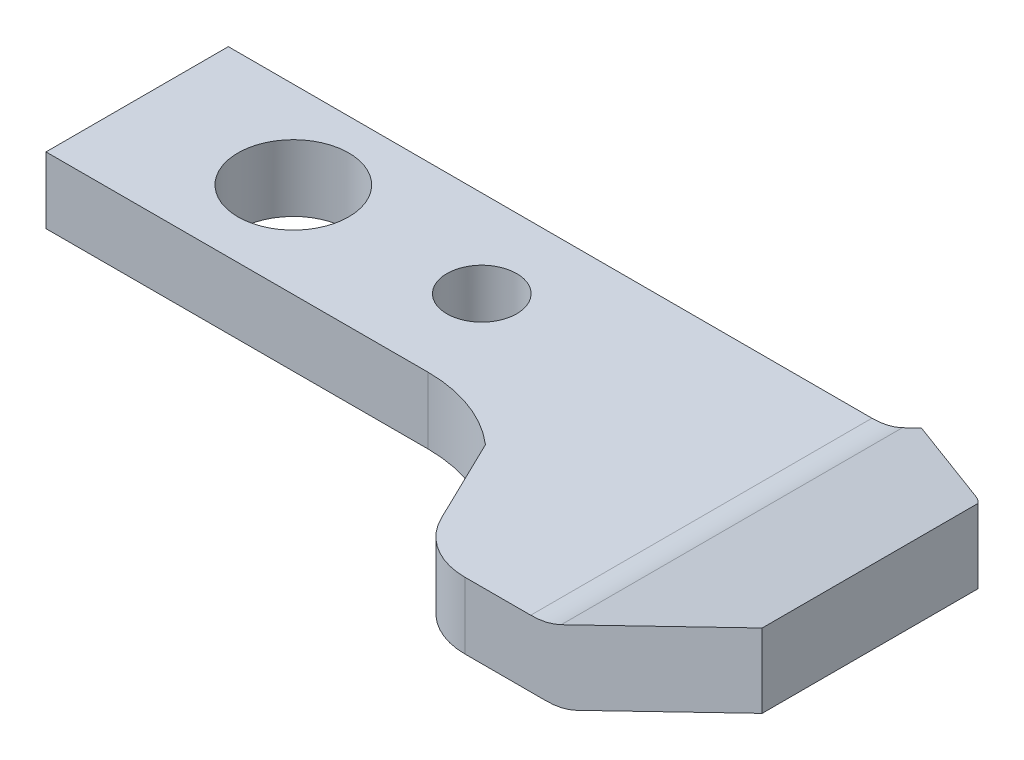
ISO-10303-21;
HEADER;
FILE_DESCRIPTION(('STEP AP214'),'2;1');
FILE_NAME('part.step','',(''),(''),'','','');
FILE_SCHEMA(('AUTOMOTIVE_DESIGN { 1 0 10303 214 1 1 1 1 }'));
ENDSEC;
DATA;
#1=APPLICATION_CONTEXT('core data for automotive mechanical design processes');
#2=APPLICATION_PROTOCOL_DEFINITION('international standard','automotive_design',2000,#1);
#3=PRODUCT_CONTEXT('',#1,'mechanical');
#4=PRODUCT('Part','Part','',(#3));
#5=PRODUCT_RELATED_PRODUCT_CATEGORY('part','',(#4));
#6=PRODUCT_DEFINITION_FORMATION('','',#4);
#7=PRODUCT_DEFINITION_CONTEXT('part definition',#1,'design');
#8=PRODUCT_DEFINITION('design','',#6,#7);
#9=PRODUCT_DEFINITION_SHAPE('','',#8);
#10=(LENGTH_UNIT() NAMED_UNIT(*) SI_UNIT(.MILLI.,.METRE.));
#11=(NAMED_UNIT(*) PLANE_ANGLE_UNIT() SI_UNIT($,.RADIAN.));
#12=(NAMED_UNIT(*) SI_UNIT($,.STERADIAN.) SOLID_ANGLE_UNIT());
#13=UNCERTAINTY_MEASURE_WITH_UNIT(LENGTH_MEASURE(1.E-05),#10,'distance_accuracy_value','');
#14=(GEOMETRIC_REPRESENTATION_CONTEXT(3) GLOBAL_UNCERTAINTY_ASSIGNED_CONTEXT((#13)) GLOBAL_UNIT_ASSIGNED_CONTEXT((#10,
#11,#12)) REPRESENTATION_CONTEXT('',''));
#15=CARTESIAN_POINT('',(0.,0.,0.));
#16=DIRECTION('',(0.,0.,1.));
#17=DIRECTION('',(1.,0.,0.));
#18=AXIS2_PLACEMENT_3D('',#15,#16,#17);
#19=CARTESIAN_POINT('',(-11.156946072554,-141.033274081149,100.));
#20=DIRECTION('',(0.436957173482005,-0.899482311411746,0.));
#21=DIRECTION('',(-0.899482311411746,-0.436957173482005,0.));
#22=AXIS2_PLACEMENT_3D('',#19,#20,#21);
#23=PLANE('',#22);
#24=DIRECTION('',(0.899482311411746,0.436957173482005,0.));
#25=VECTOR('',#24,1.);
#26=CARTESIAN_POINT('',(-11.156946072554,-141.033274081149,48.8915210531004));
#27=LINE('',#26,#25);
#28=CARTESIAN_POINT('',(-93.4183407198461,-180.994823114117,48.8915210531005));
#29=VERTEX_POINT('',#28);
#30=CARTESIAN_POINT('',(-64.6259510493756,-167.007842993902,48.8915210531005));
#31=VERTEX_POINT('',#30);
#32=EDGE_CURVE('E143',#29,#31,#27,.T.);
#33=ORIENTED_EDGE('',*,*,#32,.T.);
#34=DIRECTION('',(0.,0.,1.));
#35=VECTOR('',#34,1.);
#36=CARTESIAN_POINT('',(-64.6259510493756,-167.007842993902,100.));
#37=LINE('',#36,#35);
#38=CARTESIAN_POINT('',(-64.6259510493756,-167.007842993902,17.9722794085449));
#39=VERTEX_POINT('',#38);
#40=EDGE_CURVE('E146',#39,#31,#37,.T.);
#41=ORIENTED_EDGE('',*,*,#40,.F.);
#42=CARTESIAN_POINT('',(-72.0254817983418,-170.602441798282,24.6988643292236));
#43=DIRECTION('',(-0.436957173482005,0.899482311411746,0.));
#44=DIRECTION('',(0.899482311411746,0.436957173482005,0.));
#45=AXIS2_PLACEMENT_3D('',#42,#43,#44);
#46=ELLIPSE('',#45,11.117506006655,9.99999999999999);
#47=CARTESIAN_POINT('',(-66.4231735756112,-167.880911052294,16.4154989154848));
#48=VERTEX_POINT('',#47);
#49=EDGE_CURVE('E237',#48,#39,#46,.F.);
#50=ORIENTED_EDGE('',*,*,#49,.F.);
#51=DIRECTION('',(0.768454775547927,0.373305647495344,0.519730845232094));
#52=VECTOR('',#51,1.);
#53=CARTESIAN_POINT('',(7.29731681736619,-132.068425691393,66.2750534423562));
#54=LINE('',#53,#52);
#55=CARTESIAN_POINT('',(-90.6063758633585,-179.628806017358,0.0596162202828217));
#56=VERTEX_POINT('',#55);
#57=EDGE_CURVE('E239',#56,#48,#54,.T.);
#58=ORIENTED_EDGE('',*,*,#57,.F.);
#59=CARTESIAN_POINT('',(-96.2086840860891,-182.350336763346,8.34298163402165));
#60=DIRECTION('',(-0.436957173482005,0.899482311411746,0.));
#61=DIRECTION('',(0.899482311411746,0.436957173482005,0.));
#62=AXIS2_PLACEMENT_3D('',#59,#60,#61);
#63=ELLIPSE('',#62,11.117506006655,9.99999999999999);
#64=CARTESIAN_POINT('',(-90.6955490927865,-179.672125248639,0.));
#65=VERTEX_POINT('',#64);
#66=EDGE_CURVE('E216',#56,#65,#63,.T.);
#67=ORIENTED_EDGE('',*,*,#66,.T.);
#68=DIRECTION('',(0.899482311411746,0.436957173482005,0.));
#69=VECTOR('',#68,1.);
#70=CARTESIAN_POINT('',(-11.156946072554,-141.033274081149,0.));
#71=LINE('',#70,#69);
#72=CARTESIAN_POINT('',(-93.418340719846,-180.994823114117,0.));
#73=VERTEX_POINT('',#72);
#74=EDGE_CURVE('E245',#73,#65,#71,.T.);
#75=ORIENTED_EDGE('',*,*,#74,.F.);
#76=DIRECTION('',(0.,0.,-1.));
#77=VECTOR('',#76,1.);
#78=CARTESIAN_POINT('',(-93.418340719846,-180.994823114117,0.));
#79=LINE('',#78,#77);
#80=EDGE_CURVE('E150',#29,#73,#79,.T.);
#81=ORIENTED_EDGE('',*,*,#80,.F.);
#82=EDGE_LOOP('',(#33,#41,#50,#58,#67,#75,#81));
#83=FACE_BOUND('',#82,.T.);
#84=ADVANCED_FACE('F36',(#83),#23,.F.);
#85=CARTESIAN_POINT('',(-6.9927442092705,-149.605340508903,100.));
#86=DIRECTION('',(0.436957173482005,-0.899482311411746,0.));
#87=DIRECTION('',(-0.899482311411746,-0.436957173482005,0.));
#88=AXIS2_PLACEMENT_3D('',#85,#86,#87);
#89=PLANE('',#88);
#90=DIRECTION('',(0.,0.,1.));
#91=VECTOR('',#90,1.);
#92=CARTESIAN_POINT('',(-64.6259510493756,-177.602826218245,100.));
#93=LINE('',#92,#91);
#94=CARTESIAN_POINT('',(-64.6259510493756,-177.602826218245,17.9722794085449));
#95=VERTEX_POINT('',#94);
#96=CARTESIAN_POINT('',(-64.6259510493756,-177.602826218245,48.8915210531005));
#97=VERTEX_POINT('',#96);
#98=EDGE_CURVE('E163',#95,#97,#93,.T.);
#99=ORIENTED_EDGE('',*,*,#98,.T.);
#100=DIRECTION('',(0.899482311411746,0.436957173482005,0.));
#101=VECTOR('',#100,1.);
#102=CARTESIAN_POINT('',(-6.99274420927052,-149.605340508903,48.8915210531004));
#103=LINE('',#102,#101);
#104=CARTESIAN_POINT('',(-91.2260582025171,-190.524823114117,48.8915210531005));
#105=VERTEX_POINT('',#104);
#106=EDGE_CURVE('E153',#105,#97,#103,.T.);
#107=ORIENTED_EDGE('',*,*,#106,.F.);
#108=DIRECTION('',(0.,0.,-1.));
#109=VECTOR('',#108,1.);
#110=CARTESIAN_POINT('',(-91.2260582025171,-190.524823114117,100.));
#111=LINE('',#110,#109);
#112=CARTESIAN_POINT('',(-91.2260582025171,-190.524823114117,0.));
#113=VERTEX_POINT('',#112);
#114=EDGE_CURVE('E271',#113,#105,#111,.F.);
#115=ORIENTED_EDGE('',*,*,#114,.F.);
#116=DIRECTION('',(0.899482311411746,0.436957173482005,0.));
#117=VECTOR('',#116,1.);
#118=CARTESIAN_POINT('',(-6.9927442092705,-149.605340508903,0.));
#119=LINE('',#118,#117);
#120=CARTESIAN_POINT('',(-90.6955490927865,-190.267108472981,0.));
#121=VERTEX_POINT('',#120);
#122=EDGE_CURVE('E248',#113,#121,#119,.T.);
#123=ORIENTED_EDGE('',*,*,#122,.T.);
#124=CARTESIAN_POINT('',(-96.2086840860891,-192.945319987688,8.34298163402165));
#125=DIRECTION('',(-0.436957173482005,0.899482311411746,0.));
#126=DIRECTION('',(0.899482311411746,0.436957173482005,0.));
#127=AXIS2_PLACEMENT_3D('',#124,#125,#126);
#128=ELLIPSE('',#127,11.117506006655,9.99999999999999);
#129=CARTESIAN_POINT('',(-90.6063758633585,-190.2237892417,0.0596162202828356));
#130=VERTEX_POINT('',#129);
#131=EDGE_CURVE('E201',#130,#121,#128,.T.);
#132=ORIENTED_EDGE('',*,*,#131,.F.);
#133=DIRECTION('',(0.768454775547927,0.373305647495344,0.519730845232094));
#134=VECTOR('',#133,1.);
#135=CARTESIAN_POINT('',(10.3366838425226,-141.186922710684,68.3306757681187));
#136=LINE('',#135,#134);
#137=CARTESIAN_POINT('',(-66.4231735756112,-178.475894276636,16.4154989154848));
#138=VERTEX_POINT('',#137);
#139=EDGE_CURVE('E261',#130,#138,#136,.T.);
#140=ORIENTED_EDGE('',*,*,#139,.T.);
#141=CARTESIAN_POINT('',(-72.0254817983418,-181.197425022624,24.6988643292236));
#142=DIRECTION('',(-0.436957173482005,0.899482311411746,0.));
#143=DIRECTION('',(0.899482311411746,0.436957173482005,0.));
#144=AXIS2_PLACEMENT_3D('',#141,#142,#143);
#145=ELLIPSE('',#144,11.117506006655,9.99999999999999);
#146=EDGE_CURVE('E258',#138,#95,#145,.F.);
#147=ORIENTED_EDGE('',*,*,#146,.T.);
#148=EDGE_LOOP('',(#99,#107,#115,#123,#132,#140,#147));
#149=FACE_BOUND('',#148,.T.);
#150=ADVANCED_FACE('F308',(#149),#89,.T.);
#151=CARTESIAN_POINT('',(0.,-182.,100.));
#152=DIRECTION('',(0.,-1.,0.));
#153=DIRECTION('',(-1.,0.,0.));
#154=AXIS2_PLACEMENT_3D('',#151,#152,#153);
#155=PLANE('',#154);
#156=CARTESIAN_POINT('',(-168.195527475241,-182.,12.4999999999985));
#157=DIRECTION('',(0.,-1.,0.));
#158=DIRECTION('',(1.,0.,0.));
#159=AXIS2_PLACEMENT_3D('',#156,#157,#158);
#160=CIRCLE('',#159,7.94);
#161=CARTESIAN_POINT('',(-160.255527475241,-182.,12.4999999999985));
#162=VERTEX_POINT('',#161);
#163=EDGE_CURVE('E167',#162,#162,#160,.T.);
#164=ORIENTED_EDGE('',*,*,#163,.T.);
#165=EDGE_LOOP('',(#164));
#166=FACE_BOUND('',#165,.T.);
#167=CARTESIAN_POINT('',(-141.195527475241,-182.,12.4999999999987));
#168=DIRECTION('',(0.,1.,0.));
#169=DIRECTION('',(-1.,0.,0.));
#170=AXIS2_PLACEMENT_3D('',#167,#168,#169);
#171=CIRCLE('',#170,4.99999999999999);
#172=CARTESIAN_POINT('',(-146.195527475241,-182.,12.4999999999987));
#173=VERTEX_POINT('',#172);
#174=EDGE_CURVE('E177',#173,#173,#171,.T.);
#175=ORIENTED_EDGE('',*,*,#174,.F.);
#176=EDGE_LOOP('',(#175));
#177=FACE_BOUND('',#176,.T.);
#178=DIRECTION('',(1.,0.,0.));
#179=VECTOR('',#178,1.);
#180=CARTESIAN_POINT('',(0.,-182.,0.));
#181=LINE('',#180,#179);
#182=CARTESIAN_POINT('',(-190.011984345277,-182.,0.));
#183=VERTEX_POINT('',#182);
#184=CARTESIAN_POINT('',(-97.7879124546661,-182.,0.));
#185=VERTEX_POINT('',#184);
#186=EDGE_CURVE('E242',#183,#185,#181,.T.);
#187=ORIENTED_EDGE('',*,*,#186,.F.);
#188=DIRECTION('',(0.,0.,1.));
#189=VECTOR('',#188,1.);
#190=CARTESIAN_POINT('',(-190.011984345277,-182.,100.));
#191=LINE('',#190,#189);
#192=CARTESIAN_POINT('',(-190.011984345277,-182.,26.1261014571455));
#193=VERTEX_POINT('',#192);
#194=EDGE_CURVE('E219',#183,#193,#191,.T.);
#195=ORIENTED_EDGE('',*,*,#194,.T.);
#196=DIRECTION('',(0.999999797928441,0.,-0.000635722484010232));
#197=VECTOR('',#196,1.);
#198=CARTESIAN_POINT('',(-0.0470400808231702,-182.,26.0053364464997));
#199=LINE('',#198,#197);
#200=CARTESIAN_POINT('',(-135.299104153968,-182.,26.0913192420144));
#201=VERTEX_POINT('',#200);
#202=EDGE_CURVE('E225',#193,#201,#199,.T.);
#203=ORIENTED_EDGE('',*,*,#202,.T.);
#204=CARTESIAN_POINT('',(-135.286389704288,-182.,46.0913152005833));
#205=DIRECTION('',(0.,1.,0.));
#206=DIRECTION('',(-1.,0.,0.));
#207=AXIS2_PLACEMENT_3D('',#204,#205,#206);
#208=CIRCLE('',#207,20.);
#209=CARTESIAN_POINT('',(-122.187975643177,-182.,30.9773630674155));
#210=VERTEX_POINT('',#209);
#211=EDGE_CURVE('E228',#210,#201,#208,.T.);
#212=ORIENTED_EDGE('',*,*,#211,.F.);
#213=DIRECTION('',(0.436030754982638,0.,0.899931764473991));
#214=VECTOR('',#213,1.);
#215=CARTESIAN_POINT('',(-71.8729136030009,-182.,134.823529981116));
#216=LINE('',#215,#214);
#217=CARTESIAN_POINT('',(-116.240808662594,-182.,43.2518286029268));
#218=VERTEX_POINT('',#217);
#219=EDGE_CURVE('E231',#210,#218,#216,.T.);
#220=ORIENTED_EDGE('',*,*,#219,.T.);
#221=CARTESIAN_POINT('',(-107.241491017854,-182.,38.8915210531005));
#222=DIRECTION('',(0.,1.,0.));
#223=DIRECTION('',(-1.,0.,0.));
#224=AXIS2_PLACEMENT_3D('',#221,#222,#223);
#225=CIRCLE('',#224,10.);
#226=CARTESIAN_POINT('',(-107.241491017854,-182.,48.8915210531005));
#227=VERTEX_POINT('',#226);
#228=EDGE_CURVE('E234',#218,#227,#225,.T.);
#229=ORIENTED_EDGE('',*,*,#228,.T.);
#230=DIRECTION('',(1.,0.,0.));
#231=VECTOR('',#230,1.);
#232=CARTESIAN_POINT('',(0.,-182.,48.8915210531004));
#233=LINE('',#232,#231);
#234=CARTESIAN_POINT('',(-97.7879124546661,-182.,48.8915210531005));
#235=VERTEX_POINT('',#234);
#236=EDGE_CURVE('E152',#227,#235,#233,.T.);
#237=ORIENTED_EDGE('',*,*,#236,.T.);
#238=DIRECTION('',(0.,0.,-1.));
#239=VECTOR('',#238,1.);
#240=CARTESIAN_POINT('',(-97.7879124546661,-182.,48.8915210531005));
#241=LINE('',#240,#239);
#242=EDGE_CURVE('E265',#185,#235,#241,.F.);
#243=ORIENTED_EDGE('',*,*,#242,.F.);
#244=EDGE_LOOP('',(#187,#195,#203,#212,#220,#229,#237,#243));
#245=FACE_BOUND('',#244,.T.);
#246=ADVANCED_FACE('F279',(#166,#177,#245),#155,.F.);
#247=CARTESIAN_POINT('',(0.,-191.53,100.));
#248=DIRECTION('',(0.,-1.,0.));
#249=DIRECTION('',(-1.,0.,0.));
#250=AXIS2_PLACEMENT_3D('',#247,#248,#249);
#251=PLANE('',#250);
#252=CARTESIAN_POINT('',(-168.195527475241,-191.53,12.4999999999985));
#253=DIRECTION('',(0.,1.,0.));
#254=DIRECTION('',(0.,0.,1.));
#255=AXIS2_PLACEMENT_3D('',#252,#253,#254);
#256=CIRCLE('',#255,7.94);
#257=CARTESIAN_POINT('',(-168.195527475241,-191.53,20.4399999999985));
#258=VERTEX_POINT('',#257);
#259=EDGE_CURVE('E171',#258,#258,#256,.T.);
#260=ORIENTED_EDGE('',*,*,#259,.T.);
#261=EDGE_LOOP('',(#260));
#262=FACE_BOUND('',#261,.T.);
#263=CARTESIAN_POINT('',(-141.195527475241,-191.53,12.4999999999987));
#264=DIRECTION('',(0.,-1.,0.));
#265=DIRECTION('',(1.,0.,0.));
#266=AXIS2_PLACEMENT_3D('',#263,#264,#265);
#267=CIRCLE('',#266,4.99999999999999);
#268=CARTESIAN_POINT('',(-136.195527475241,-191.53,12.4999999999987));
#269=VERTEX_POINT('',#268);
#270=EDGE_CURVE('E162',#269,#269,#267,.T.);
#271=ORIENTED_EDGE('',*,*,#270,.F.);
#272=EDGE_LOOP('',(#271));
#273=FACE_BOUND('',#272,.T.);
#274=DIRECTION('',(-1.,0.,0.));
#275=VECTOR('',#274,1.);
#276=CARTESIAN_POINT('',(0.,-191.53,48.8915210531004));
#277=LINE('',#276,#275);
#278=CARTESIAN_POINT('',(-95.5956299373372,-191.53,48.8915210531005));
#279=VERTEX_POINT('',#278);
#280=CARTESIAN_POINT('',(-107.241491017854,-191.53,48.8915210531005));
#281=VERTEX_POINT('',#280);
#282=EDGE_CURVE('E183',#279,#281,#277,.T.);
#283=ORIENTED_EDGE('',*,*,#282,.T.);
#284=CARTESIAN_POINT('',(-107.241491017854,-191.53,38.8915210531005));
#285=DIRECTION('',(0.,-1.,0.));
#286=DIRECTION('',(1.,0.,0.));
#287=AXIS2_PLACEMENT_3D('',#284,#285,#286);
#288=CIRCLE('',#287,10.);
#289=CARTESIAN_POINT('',(-116.240808662594,-191.53,43.2518286029268));
#290=VERTEX_POINT('',#289);
#291=EDGE_CURVE('E180',#281,#290,#288,.T.);
#292=ORIENTED_EDGE('',*,*,#291,.T.);
#293=DIRECTION('',(-0.436030754982638,0.,-0.899931764473991));
#294=VECTOR('',#293,1.);
#295=CARTESIAN_POINT('',(-111.112706272646,-191.53,53.8358119101887));
#296=LINE('',#295,#294);
#297=CARTESIAN_POINT('',(-122.187975643177,-191.53,30.9773630674155));
#298=VERTEX_POINT('',#297);
#299=EDGE_CURVE('E195',#290,#298,#296,.T.);
#300=ORIENTED_EDGE('',*,*,#299,.T.);
#301=CARTESIAN_POINT('',(-135.286389704288,-191.53,46.0913152005833));
#302=DIRECTION('',(0.,-1.,0.));
#303=DIRECTION('',(1.,0.,0.));
#304=AXIS2_PLACEMENT_3D('',#301,#302,#303);
#305=CIRCLE('',#304,20.);
#306=CARTESIAN_POINT('',(-135.299104153968,-191.53,26.0913192420144));
#307=VERTEX_POINT('',#306);
#308=EDGE_CURVE('E192',#307,#298,#305,.T.);
#309=ORIENTED_EDGE('',*,*,#308,.F.);
#310=DIRECTION('',(-0.999999797928441,0.,0.000635722484010232));
#311=VECTOR('',#310,1.);
#312=CARTESIAN_POINT('',(0.0165321547317113,-191.53,26.005296032192));
#313=LINE('',#312,#311);
#314=CARTESIAN_POINT('',(-190.011984345277,-191.53,26.1261014571455));
#315=VERTEX_POINT('',#314);
#316=EDGE_CURVE('E189',#307,#315,#313,.T.);
#317=ORIENTED_EDGE('',*,*,#316,.T.);
#318=DIRECTION('',(0.,0.,-1.));
#319=VECTOR('',#318,1.);
#320=CARTESIAN_POINT('',(-190.011984345277,-191.53,0.));
#321=LINE('',#320,#319);
#322=CARTESIAN_POINT('',(-190.011984345277,-191.53,0.));
#323=VERTEX_POINT('',#322);
#324=EDGE_CURVE('E186',#315,#323,#321,.T.);
#325=ORIENTED_EDGE('',*,*,#324,.T.);
#326=DIRECTION('',(1.,0.,0.));
#327=VECTOR('',#326,1.);
#328=CARTESIAN_POINT('',(0.,-191.53,0.));
#329=LINE('',#328,#327);
#330=CARTESIAN_POINT('',(-95.5956299373372,-191.53,0.));
#331=VERTEX_POINT('',#330);
#332=EDGE_CURVE('E251',#323,#331,#329,.T.);
#333=ORIENTED_EDGE('',*,*,#332,.T.);
#334=DIRECTION('',(0.,0.,-1.));
#335=VECTOR('',#334,1.);
#336=CARTESIAN_POINT('',(-95.5956299373372,-191.53,100.));
#337=LINE('',#336,#335);
#338=EDGE_CURVE('E268',#279,#331,#337,.T.);
#339=ORIENTED_EDGE('',*,*,#338,.F.);
#340=EDGE_LOOP('',(#283,#292,#300,#309,#317,#325,#333,#339));
#341=FACE_BOUND('',#340,.T.);
#342=ADVANCED_FACE('F305',(#262,#273,#341),#251,.T.);
#343=CARTESIAN_POINT('',(0.,-164.,0.));
#344=DIRECTION('',(0.,0.,1.));
#345=DIRECTION('',(1.,0.,0.));
#346=AXIS2_PLACEMENT_3D('',#343,#344,#345);
#347=PLANE('',#346);
#348=ORIENTED_EDGE('',*,*,#332,.F.);
#349=DIRECTION('',(0.,1.,0.));
#350=VECTOR('',#349,1.);
#351=CARTESIAN_POINT('',(-190.011984345277,-164.,0.));
#352=LINE('',#351,#350);
#353=EDGE_CURVE('E256',#323,#183,#352,.T.);
#354=ORIENTED_EDGE('',*,*,#353,.T.);
#355=ORIENTED_EDGE('',*,*,#186,.T.);
#356=CARTESIAN_POINT('',(-97.7879124546661,-172.,0.));
#357=DIRECTION('',(0.,0.,-1.));
#358=DIRECTION('',(1.,0.,0.));
#359=AXIS2_PLACEMENT_3D('',#356,#357,#358);
#360=CIRCLE('',#359,10.);
#361=EDGE_CURVE('E44',#73,#185,#360,.T.);
#362=ORIENTED_EDGE('',*,*,#361,.F.);
#363=ORIENTED_EDGE('',*,*,#74,.T.);
#364=DIRECTION('',(0.,1.,0.));
#365=VECTOR('',#364,1.);
#366=CARTESIAN_POINT('',(-90.6955490927865,-191.53,0.));
#367=LINE('',#366,#365);
#368=EDGE_CURVE('E254',#65,#121,#367,.F.);
#369=ORIENTED_EDGE('',*,*,#368,.T.);
#370=ORIENTED_EDGE('',*,*,#122,.F.);
#371=CARTESIAN_POINT('',(-95.5956299373372,-181.53,0.));
#372=DIRECTION('',(0.,0.,-1.));
#373=DIRECTION('',(1.,0.,0.));
#374=AXIS2_PLACEMENT_3D('',#371,#372,#373);
#375=CIRCLE('',#374,10.);
#376=EDGE_CURVE('E58',#331,#113,#375,.F.);
#377=ORIENTED_EDGE('',*,*,#376,.F.);
#378=EDGE_LOOP('',(#348,#354,#355,#362,#363,#369,#370,#377));
#379=FACE_BOUND('',#378,.T.);
#380=ADVANCED_FACE('F282',(#379),#347,.F.);
#381=CARTESIAN_POINT('',(-28.4652534271616,-191.53,42.0876692887374));
#382=DIRECTION('',(-0.560230822273064,0.,0.828336541373883));
#383=DIRECTION('',(0.828336541373883,0.,0.560230822273064));
#384=AXIS2_PLACEMENT_3D('',#381,#382,#383);
#385=PLANE('',#384);
#386=DIRECTION('',(0.,1.,0.));
#387=VECTOR('',#386,1.);
#388=CARTESIAN_POINT('',(-90.6063758633585,-191.53,0.059616220282839));
#389=LINE('',#388,#387);
#390=EDGE_CURVE('E208',#130,#56,#389,.T.);
#391=ORIENTED_EDGE('',*,*,#390,.T.);
#392=ORIENTED_EDGE('',*,*,#57,.T.);
#393=DIRECTION('',(0.,1.,0.));
#394=VECTOR('',#393,1.);
#395=CARTESIAN_POINT('',(-66.4231735756111,-191.53,16.4154989154848));
#396=LINE('',#395,#394);
#397=EDGE_CURVE('E210',#138,#48,#396,.T.);
#398=ORIENTED_EDGE('',*,*,#397,.F.);
#399=ORIENTED_EDGE('',*,*,#139,.F.);
#400=EDGE_LOOP('',(#391,#392,#398,#399));
#401=FACE_BOUND('',#400,.T.);
#402=ADVANCED_FACE('F315',(#401),#385,.F.);
#403=CARTESIAN_POINT('',(-72.0254817983418,-191.53,24.6988643292236));
#404=DIRECTION('',(0.,1.,0.));
#405=DIRECTION('',(1.,0.,0.));
#406=AXIS2_PLACEMENT_3D('',#403,#404,#405);
#407=CYLINDRICAL_SURFACE('',#406,9.99999999999999);
#408=ORIENTED_EDGE('',*,*,#397,.T.);
#409=ORIENTED_EDGE('',*,*,#49,.T.);
#410=DIRECTION('',(0.,1.,0.));
#411=VECTOR('',#410,1.);
#412=CARTESIAN_POINT('',(-64.6259510493756,-191.53,17.9722794085448));
#413=LINE('',#412,#411);
#414=EDGE_CURVE('E161',#95,#39,#413,.T.);
#415=ORIENTED_EDGE('',*,*,#414,.F.);
#416=ORIENTED_EDGE('',*,*,#146,.F.);
#417=EDGE_LOOP('',(#408,#409,#415,#416));
#418=FACE_BOUND('',#417,.T.);
#419=ADVANCED_FACE('F311',(#418),#407,.T.);
#420=CARTESIAN_POINT('',(-107.241491017854,-191.53,38.8915210531005));
#421=DIRECTION('',(0.,1.,0.));
#422=DIRECTION('',(1.,0.,0.));
#423=AXIS2_PLACEMENT_3D('',#420,#421,#422);
#424=CYLINDRICAL_SURFACE('',#423,10.);
#425=ORIENTED_EDGE('',*,*,#228,.F.);
#426=DIRECTION('',(0.,1.,0.));
#427=VECTOR('',#426,1.);
#428=CARTESIAN_POINT('',(-116.240808662594,-191.53,43.2518286029268));
#429=LINE('',#428,#427);
#430=EDGE_CURVE('E199',#290,#218,#429,.T.);
#431=ORIENTED_EDGE('',*,*,#430,.F.);
#432=ORIENTED_EDGE('',*,*,#291,.F.);
#433=DIRECTION('',(0.,1.,0.));
#434=VECTOR('',#433,1.);
#435=CARTESIAN_POINT('',(-107.241491017854,-191.53,48.8915210531005));
#436=LINE('',#435,#434);
#437=EDGE_CURVE('E198',#281,#227,#436,.T.);
#438=ORIENTED_EDGE('',*,*,#437,.T.);
#439=EDGE_LOOP('',(#425,#431,#432,#438));
#440=FACE_BOUND('',#439,.T.);
#441=ADVANCED_FACE('F301',(#440),#424,.T.);
#442=CARTESIAN_POINT('',(-111.112706272646,-191.53,53.8358119101887));
#443=DIRECTION('',(-0.899931764473991,0.,0.436030754982638));
#444=DIRECTION('',(0.436030754982638,0.,0.899931764473991));
#445=AXIS2_PLACEMENT_3D('',#442,#443,#444);
#446=PLANE('',#445);
#447=ORIENTED_EDGE('',*,*,#219,.F.);
#448=DIRECTION('',(0.,1.,0.));
#449=VECTOR('',#448,1.);
#450=CARTESIAN_POINT('',(-122.187975643177,-191.53,30.9773630674155));
#451=LINE('',#450,#449);
#452=EDGE_CURVE('E202',#298,#210,#451,.T.);
#453=ORIENTED_EDGE('',*,*,#452,.F.);
#454=ORIENTED_EDGE('',*,*,#299,.F.);
#455=ORIENTED_EDGE('',*,*,#430,.T.);
#456=EDGE_LOOP('',(#447,#453,#454,#455));
#457=FACE_BOUND('',#456,.T.);
#458=ADVANCED_FACE('F298',(#457),#446,.T.);
#459=CARTESIAN_POINT('',(-135.286389704288,-191.53,46.0913152005833));
#460=DIRECTION('',(0.,1.,0.));
#461=DIRECTION('',(1.,0.,0.));
#462=AXIS2_PLACEMENT_3D('',#459,#460,#461);
#463=CYLINDRICAL_SURFACE('',#462,20.);
#464=ORIENTED_EDGE('',*,*,#452,.T.);
#465=ORIENTED_EDGE('',*,*,#211,.T.);
#466=DIRECTION('',(0.,1.,0.));
#467=VECTOR('',#466,1.);
#468=CARTESIAN_POINT('',(-135.299104153968,-191.53,26.0913192420144));
#469=LINE('',#468,#467);
#470=EDGE_CURVE('E204',#307,#201,#469,.T.);
#471=ORIENTED_EDGE('',*,*,#470,.F.);
#472=ORIENTED_EDGE('',*,*,#308,.T.);
#473=EDGE_LOOP('',(#464,#465,#471,#472));
#474=FACE_BOUND('',#473,.T.);
#475=ADVANCED_FACE('F294',(#474),#463,.F.);
#476=CARTESIAN_POINT('',(0.0165321547317113,-191.53,26.005296032192));
#477=DIRECTION('',(0.000635722484010232,0.,0.999999797928441));
#478=DIRECTION('',(0.999999797928441,0.,-0.000635722484010232));
#479=AXIS2_PLACEMENT_3D('',#476,#477,#478);
#480=PLANE('',#479);
#481=ORIENTED_EDGE('',*,*,#202,.F.);
#482=DIRECTION('',(0.,1.,0.));
#483=VECTOR('',#482,1.);
#484=CARTESIAN_POINT('',(-190.011984345277,-191.53,26.1261014571455));
#485=LINE('',#484,#483);
#486=EDGE_CURVE('E206',#315,#193,#485,.T.);
#487=ORIENTED_EDGE('',*,*,#486,.F.);
#488=ORIENTED_EDGE('',*,*,#316,.F.);
#489=ORIENTED_EDGE('',*,*,#470,.T.);
#490=EDGE_LOOP('',(#481,#487,#488,#489));
#491=FACE_BOUND('',#490,.T.);
#492=ADVANCED_FACE('F290',(#491),#480,.T.);
#493=CARTESIAN_POINT('',(0.,-191.53,48.8915210531004));
#494=DIRECTION('',(0.,0.,1.));
#495=DIRECTION('',(1.,0.,0.));
#496=AXIS2_PLACEMENT_3D('',#493,#494,#495);
#497=PLANE('',#496);
#498=ORIENTED_EDGE('',*,*,#106,.T.);
#499=DIRECTION('',(0.,-1.,0.));
#500=VECTOR('',#499,1.);
#501=CARTESIAN_POINT('',(-64.6259510493756,9.53000000000002,48.8915210531005));
#502=LINE('',#501,#500);
#503=EDGE_CURVE('E158',#31,#97,#502,.T.);
#504=ORIENTED_EDGE('',*,*,#503,.F.);
#505=ORIENTED_EDGE('',*,*,#32,.F.);
#506=CARTESIAN_POINT('',(-97.7879124546661,-172.,48.8915210531005));
#507=DIRECTION('',(0.,0.,-1.));
#508=DIRECTION('',(1.,0.,0.));
#509=AXIS2_PLACEMENT_3D('',#506,#507,#508);
#510=CIRCLE('',#509,10.);
#511=EDGE_CURVE('E11',#235,#29,#510,.F.);
#512=ORIENTED_EDGE('',*,*,#511,.F.);
#513=ORIENTED_EDGE('',*,*,#236,.F.);
#514=ORIENTED_EDGE('',*,*,#437,.F.);
#515=ORIENTED_EDGE('',*,*,#282,.F.);
#516=CARTESIAN_POINT('',(-95.5956299373372,-181.53,48.8915210531005));
#517=DIRECTION('',(0.,0.,-1.));
#518=DIRECTION('',(1.,0.,0.));
#519=AXIS2_PLACEMENT_3D('',#516,#517,#518);
#520=CIRCLE('',#519,10.);
#521=EDGE_CURVE('E51',#105,#279,#520,.T.);
#522=ORIENTED_EDGE('',*,*,#521,.F.);
#523=EDGE_LOOP('',(#498,#504,#505,#512,#513,#514,#515,#522));
#524=FACE_BOUND('',#523,.T.);
#525=ADVANCED_FACE('F165',(#524),#497,.T.);
#526=CARTESIAN_POINT('',(-190.011984345277,-191.53,0.));
#527=DIRECTION('',(-1.,0.,0.));
#528=DIRECTION('',(0.,1.,0.));
#529=AXIS2_PLACEMENT_3D('',#526,#527,#528);
#530=PLANE('',#529);
#531=ORIENTED_EDGE('',*,*,#194,.F.);
#532=ORIENTED_EDGE('',*,*,#353,.F.);
#533=ORIENTED_EDGE('',*,*,#324,.F.);
#534=ORIENTED_EDGE('',*,*,#486,.T.);
#535=EDGE_LOOP('',(#531,#532,#533,#534));
#536=FACE_BOUND('',#535,.T.);
#537=ADVANCED_FACE('F286',(#536),#530,.T.);
#538=CARTESIAN_POINT('',(-96.2086840860891,-191.53,8.34298163402165));
#539=DIRECTION('',(0.,1.,0.));
#540=DIRECTION('',(1.,0.,0.));
#541=AXIS2_PLACEMENT_3D('',#538,#539,#540);
#542=CYLINDRICAL_SURFACE('',#541,9.99999999999999);
#543=ORIENTED_EDGE('',*,*,#66,.F.);
#544=ORIENTED_EDGE('',*,*,#390,.F.);
#545=ORIENTED_EDGE('',*,*,#131,.T.);
#546=ORIENTED_EDGE('',*,*,#368,.F.);
#547=EDGE_LOOP('',(#543,#544,#545,#546));
#548=FACE_BOUND('',#547,.T.);
#549=ADVANCED_FACE('F319',(#548),#542,.T.);
#550=CARTESIAN_POINT('',(-141.195527475241,-191.53,12.4999999999987));
#551=DIRECTION('',(0.,1.,0.));
#552=DIRECTION('',(1.,0.,0.));
#553=AXIS2_PLACEMENT_3D('',#550,#551,#552);
#554=CYLINDRICAL_SURFACE('',#553,4.99999999999999);
#555=ORIENTED_EDGE('',*,*,#270,.T.);
#556=EDGE_LOOP('',(#555));
#557=FACE_BOUND('',#556,.T.);
#558=ORIENTED_EDGE('',*,*,#174,.T.);
#559=EDGE_LOOP('',(#558));
#560=FACE_BOUND('',#559,.T.);
#561=ADVANCED_FACE('F321',(#557,#560),#554,.F.);
#562=CARTESIAN_POINT('',(-97.7879124546661,-172.,100.));
#563=DIRECTION('',(0.,0.,1.));
#564=DIRECTION('',(1.,0.,0.));
#565=AXIS2_PLACEMENT_3D('',#562,#563,#564);
#566=CYLINDRICAL_SURFACE('',#565,10.);
#567=ORIENTED_EDGE('',*,*,#511,.T.);
#568=ORIENTED_EDGE('',*,*,#80,.T.);
#569=ORIENTED_EDGE('',*,*,#361,.T.);
#570=ORIENTED_EDGE('',*,*,#242,.T.);
#571=EDGE_LOOP('',(#567,#568,#569,#570));
#572=FACE_BOUND('',#571,.T.);
#573=ADVANCED_FACE('F275',(#572),#566,.F.);
#574=CARTESIAN_POINT('',(-95.5956299373372,-181.53,100.));
#575=DIRECTION('',(0.,0.,-1.));
#576=DIRECTION('',(-1.,0.,0.));
#577=AXIS2_PLACEMENT_3D('',#574,#575,#576);
#578=CYLINDRICAL_SURFACE('',#577,10.);
#579=ORIENTED_EDGE('',*,*,#521,.T.);
#580=ORIENTED_EDGE('',*,*,#338,.T.);
#581=ORIENTED_EDGE('',*,*,#376,.T.);
#582=ORIENTED_EDGE('',*,*,#114,.T.);
#583=EDGE_LOOP('',(#579,#580,#581,#582));
#584=FACE_BOUND('',#583,.T.);
#585=ADVANCED_FACE('F38',(#584),#578,.T.);
#586=CARTESIAN_POINT('',(-64.6259510493756,9.53000000000002,48.8915210531005));
#587=DIRECTION('',(1.,0.,0.));
#588=DIRECTION('',(0.,1.,0.));
#589=AXIS2_PLACEMENT_3D('',#586,#587,#588);
#590=PLANE('',#589);
#591=ORIENTED_EDGE('',*,*,#40,.T.);
#592=ORIENTED_EDGE('',*,*,#503,.T.);
#593=ORIENTED_EDGE('',*,*,#98,.F.);
#594=ORIENTED_EDGE('',*,*,#414,.T.);
#595=EDGE_LOOP('',(#591,#592,#593,#594));
#596=FACE_BOUND('',#595,.T.);
#597=ADVANCED_FACE('F157',(#596),#590,.T.);
#598=CARTESIAN_POINT('',(-168.195527475241,-191.53,12.4999999999985));
#599=DIRECTION('',(0.,1.,0.));
#600=DIRECTION('',(0.,0.,1.));
#601=AXIS2_PLACEMENT_3D('',#598,#599,#600);
#602=CYLINDRICAL_SURFACE('',#601,7.94);
#603=ORIENTED_EDGE('',*,*,#259,.F.);
#604=EDGE_LOOP('',(#603));
#605=FACE_BOUND('',#604,.T.);
#606=ORIENTED_EDGE('',*,*,#163,.F.);
#607=EDGE_LOOP('',(#606));
#608=FACE_BOUND('',#607,.T.);
#609=ADVANCED_FACE('F348',(#605,#608),#602,.F.);
#610=CLOSED_SHELL('',(#84,#150,#246,#342,#380,#402,#419,#441,#458,#475,#492,#525,#537,#549,#561,
#573,#585,#597,#609));
#611=MANIFOLD_SOLID_BREP('B2',#610);
#612=ADVANCED_BREP_SHAPE_REPRESENTATION('',(#18,#611),#14);
#613=SHAPE_DEFINITION_REPRESENTATION(#9,#612);
ENDSEC;
END-ISO-10303-21;
